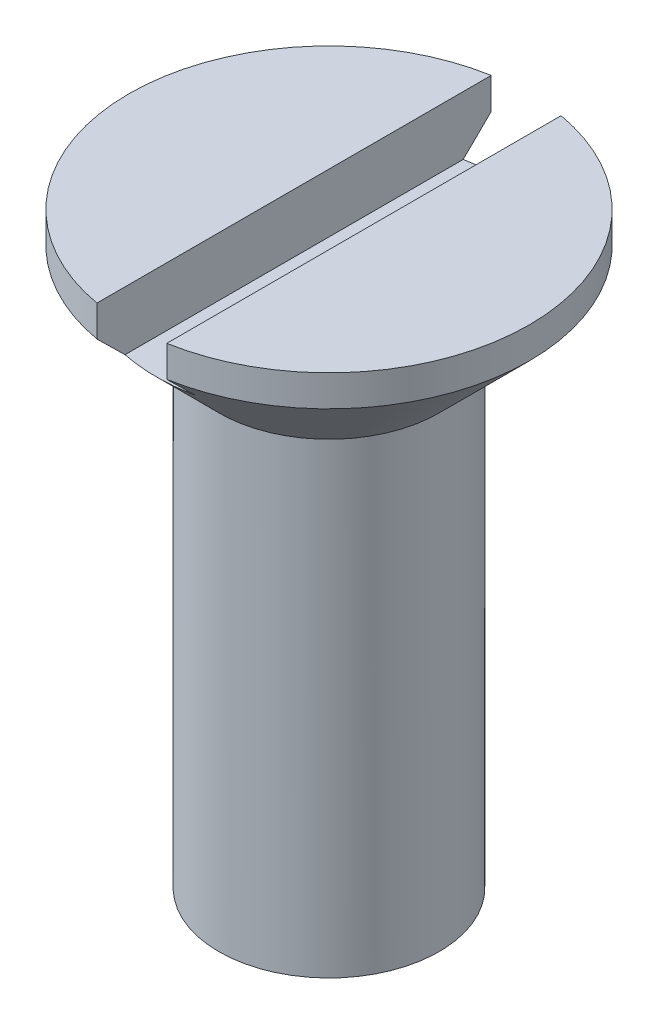
ISO-10303-21;
HEADER;
FILE_DESCRIPTION(('STEP AP214'),'2;1');
FILE_NAME('part.step','',(''),(''),'','','');
FILE_SCHEMA(('AUTOMOTIVE_DESIGN { 1 0 10303 214 1 1 1 1 }'));
ENDSEC;
DATA;
#1=APPLICATION_CONTEXT('core data for automotive mechanical design processes');
#2=APPLICATION_PROTOCOL_DEFINITION('international standard','automotive_design',2000,#1);
#3=PRODUCT_CONTEXT('',#1,'mechanical');
#4=PRODUCT('Part','Part','',(#3));
#5=PRODUCT_RELATED_PRODUCT_CATEGORY('part','',(#4));
#6=PRODUCT_DEFINITION_FORMATION('','',#4);
#7=PRODUCT_DEFINITION_CONTEXT('part definition',#1,'design');
#8=PRODUCT_DEFINITION('design','',#6,#7);
#9=PRODUCT_DEFINITION_SHAPE('','',#8);
#10=(LENGTH_UNIT() NAMED_UNIT(*) SI_UNIT(.MILLI.,.METRE.));
#11=(NAMED_UNIT(*) PLANE_ANGLE_UNIT() SI_UNIT($,.RADIAN.));
#12=(NAMED_UNIT(*) SI_UNIT($,.STERADIAN.) SOLID_ANGLE_UNIT());
#13=UNCERTAINTY_MEASURE_WITH_UNIT(LENGTH_MEASURE(1.E-05),#10,'distance_accuracy_value','');
#14=(GEOMETRIC_REPRESENTATION_CONTEXT(3) GLOBAL_UNCERTAINTY_ASSIGNED_CONTEXT((#13)) GLOBAL_UNIT_ASSIGNED_CONTEXT((#10,
#11,#12)) REPRESENTATION_CONTEXT('',''));
#15=CARTESIAN_POINT('',(0.,0.,0.));
#16=DIRECTION('',(0.,0.,1.));
#17=DIRECTION('',(1.,0.,0.));
#18=AXIS2_PLACEMENT_3D('',#15,#16,#17);
#19=CARTESIAN_POINT('',(0.,17.7320510346448,0.));
#20=DIRECTION('',(0.,1.,0.));
#21=DIRECTION('',(0.,0.,1.));
#22=AXIS2_PLACEMENT_3D('',#19,#20,#21);
#23=PLANE('',#22);
#24=DIRECTION('',(0.,0.,-1.));
#25=VECTOR('',#24,1.);
#26=CARTESIAN_POINT('',(0.9500000304,17.7320510346448,-5.45000017440001));
#27=LINE('',#26,#25);
#28=CARTESIAN_POINT('',(0.9500000304,17.7320510346448,5.36656331772951));
#29=VERTEX_POINT('',#28);
#30=CARTESIAN_POINT('',(0.9500000304,17.7320510346448,-5.36656331772953));
#31=VERTEX_POINT('',#30);
#32=EDGE_CURVE('E158',#29,#31,#27,.T.);
#33=ORIENTED_EDGE('',*,*,#32,.F.);
#34=CARTESIAN_POINT('',(0.,17.7320510346448,0.));
#35=DIRECTION('',(0.,-1.,0.));
#36=DIRECTION('',(0.,0.,-1.));
#37=AXIS2_PLACEMENT_3D('',#34,#35,#36);
#38=CIRCLE('',#37,5.4500001744);
#39=EDGE_CURVE('E106',#31,#29,#38,.T.);
#40=ORIENTED_EDGE('',*,*,#39,.F.);
#41=EDGE_LOOP('',(#33,#40));
#42=FACE_BOUND('',#41,.T.);
#43=ADVANCED_FACE('F39',(#42),#23,.T.);
#44=CARTESIAN_POINT('',(0.,-3.40349764957919E-07,0.));
#45=DIRECTION('',(0.,-1.,0.));
#46=DIRECTION('',(0.,0.,-1.));
#47=AXIS2_PLACEMENT_3D('',#44,#45,#46);
#48=CYLINDRICAL_SURFACE('',#47,5.4500001744);
#49=DIRECTION('',(0.,-1.,0.));
#50=VECTOR('',#49,1.);
#51=CARTESIAN_POINT('',(0.9500000304,-3.40349764957919E-07,5.36656331772951));
#52=LINE('',#51,#50);
#53=CARTESIAN_POINT('',(0.9500000304,16.8820510074448,5.36656331772951));
#54=VERTEX_POINT('',#53);
#55=EDGE_CURVE('E154',#54,#29,#52,.F.);
#56=ORIENTED_EDGE('',*,*,#55,.F.);
#57=CARTESIAN_POINT('',(0.,16.8820510074448,0.));
#58=DIRECTION('',(0.,-1.,0.));
#59=DIRECTION('',(0.,0.,-1.));
#60=AXIS2_PLACEMENT_3D('',#57,#58,#59);
#61=CIRCLE('',#60,5.4500001744);
#62=CARTESIAN_POINT('',(0.9500000304,16.8820510074448,-5.36656331772953));
#63=VERTEX_POINT('',#62);
#64=EDGE_CURVE('E119',#63,#54,#61,.T.);
#65=ORIENTED_EDGE('',*,*,#64,.F.);
#66=DIRECTION('',(0.,-1.,0.));
#67=VECTOR('',#66,1.);
#68=CARTESIAN_POINT('',(0.9500000304,-3.40349764957919E-07,-5.36656331772953));
#69=LINE('',#68,#67);
#70=EDGE_CURVE('E155',#31,#63,#69,.T.);
#71=ORIENTED_EDGE('',*,*,#70,.F.);
#72=ORIENTED_EDGE('',*,*,#39,.T.);
#73=EDGE_LOOP('',(#56,#65,#71,#72));
#74=FACE_BOUND('',#73,.T.);
#75=ADVANCED_FACE('F153',(#74),#48,.T.);
#76=DIRECTION('',(0.,0.,1.));
#77=VECTOR('',#76,1.);
#78=CARTESIAN_POINT('',(-0.9500000304,17.7320510346448,-5.45000017440001));
#79=LINE('',#78,#77);
#80=CARTESIAN_POINT('',(-0.9500000304,17.7320510346448,-5.36656331772953));
#81=VERTEX_POINT('',#80);
#82=CARTESIAN_POINT('',(-0.9500000304,17.7320510346448,5.36656331772951));
#83=VERTEX_POINT('',#82);
#84=EDGE_CURVE('E113',#81,#83,#79,.T.);
#85=ORIENTED_EDGE('',*,*,#84,.F.);
#86=EDGE_CURVE('E139',#83,#81,#38,.T.);
#87=ORIENTED_EDGE('',*,*,#86,.F.);
#88=EDGE_LOOP('',(#85,#87));
#89=FACE_BOUND('',#88,.T.);
#90=ADVANCED_FACE('F41',(#89),#23,.T.);
#91=DIRECTION('',(0.,-1.,0.));
#92=VECTOR('',#91,1.);
#93=CARTESIAN_POINT('',(-0.9500000304,-3.40349764957919E-07,-5.36656331772953));
#94=LINE('',#93,#92);
#95=CARTESIAN_POINT('',(-0.9500000304,16.8820510074448,-5.36656331772953));
#96=VERTEX_POINT('',#95);
#97=EDGE_CURVE('E129',#96,#81,#94,.F.);
#98=ORIENTED_EDGE('',*,*,#97,.F.);
#99=CARTESIAN_POINT('',(-0.9500000304,16.8820510074448,5.36656331772951));
#100=VERTEX_POINT('',#99);
#101=EDGE_CURVE('E137',#100,#96,#61,.T.);
#102=ORIENTED_EDGE('',*,*,#101,.F.);
#103=DIRECTION('',(0.,-1.,0.));
#104=VECTOR('',#103,1.);
#105=CARTESIAN_POINT('',(-0.9500000304,-3.40349764957919E-07,5.36656331772951));
#106=LINE('',#105,#104);
#107=EDGE_CURVE('E140',#83,#100,#106,.T.);
#108=ORIENTED_EDGE('',*,*,#107,.F.);
#109=ORIENTED_EDGE('',*,*,#86,.T.);
#110=EDGE_LOOP('',(#98,#102,#108,#109));
#111=FACE_BOUND('',#110,.T.);
#112=ADVANCED_FACE('F135',(#111),#48,.T.);
#113=CARTESIAN_POINT('',(0.,14.4320509290448,0.));
#114=DIRECTION('',(0.,1.,0.));
#115=DIRECTION('',(0.,0.,1.));
#116=AXIS2_PLACEMENT_3D('',#113,#114,#115);
#117=CONICAL_SURFACE('',#116,3.000000096,0.785398163397443);
#118=CARTESIAN_POINT('',(0.9500000304,16.8827510074672,-5.36727419959969));
#119=CARTESIAN_POINT('',(0.9500000304,16.7386924674401,-5.22096959393796));
#120=CARTESIAN_POINT('',(0.9500000304,16.5947180073482,-5.07458206767703));
#121=CARTESIAN_POINT('',(0.9500000304,16.3068610950055,-4.78142894707962));
#122=CARTESIAN_POINT('',(0.9500000304,16.1629788787331,-4.63466312106346));
#123=CARTESIAN_POINT('',(0.9500000304,15.8729593844081,-4.33821750612074));
#124=CARTESIAN_POINT('',(0.9500000304,15.7268275720015,-4.18853236453173));
#125=CARTESIAN_POINT('',(0.9500000304,15.4351469328919,-3.8888863725397));
#126=CARTESIAN_POINT('',(0.9500000304,15.2895976698632,-3.73892594648746));
#127=CARTESIAN_POINT('',(0.9500000304,14.9161940999164,-3.35268742755162));
#128=CARTESIAN_POINT('',(0.9500000304,14.6887726159211,-3.11598885228054));
#129=CARTESIAN_POINT('',(0.9500000304,14.3493162824682,-2.75849645227604));
#130=CARTESIAN_POINT('',(0.9500000304,14.2362338632747,-2.63869885409774));
#131=CARTESIAN_POINT('',(0.9500000304,14.0111738661827,-2.39816365495597));
#132=CARTESIAN_POINT('',(0.9500000304,13.8991958430073,-2.27742647115378));
#133=CARTESIAN_POINT('',(0.9500000304,13.6785322820133,-2.03630437028581));
#134=CARTESIAN_POINT('',(0.9500000304,13.5698225615911,-1.91594172872546));
#135=CARTESIAN_POINT('',(0.9500000304,13.4086408679578,-1.73355254953826));
#136=CARTESIAN_POINT('',(0.9500000304,13.3551841865324,-1.6723974720414));
#137=CARTESIAN_POINT('',(0.9500000304,13.2491651392265,-1.54931827031532));
#138=CARTESIAN_POINT('',(0.9500000304,13.1966027415451,-1.48739417356874));
#139=CARTESIAN_POINT('',(0.9500000304,13.0930615618723,-1.36295303138163));
#140=CARTESIAN_POINT('',(0.9500000304,13.0420743634795,-1.30044301192786));
#141=CARTESIAN_POINT('',(0.9500000304,12.9418277371085,-1.17405785121895));
#142=CARTESIAN_POINT('',(0.9500000304,12.8925680223448,-1.11018293941513));
#143=CARTESIAN_POINT('',(0.9500000304,12.7967351000262,-0.980693198526617));
#144=CARTESIAN_POINT('',(0.9500000304,12.7501553162811,-0.915083260555827));
#145=CARTESIAN_POINT('',(0.9500000304,12.6609914990495,-0.781218224398256));
#146=CARTESIAN_POINT('',(0.9500000304,12.6184032802871,-0.712966005313571));
#147=CARTESIAN_POINT('',(0.9500000304,12.5703966914203,-0.627290850299751));
#148=CARTESIAN_POINT('',(0.9500000304,12.5618340898567,-0.611626988447319));
#149=CARTESIAN_POINT('',(0.9500000304,12.5450800997927,-0.580097723188511));
#150=CARTESIAN_POINT('',(0.9500000304,12.5368887943255,-0.564232275707041));
#151=CARTESIAN_POINT('',(0.9500000304,12.5129403971186,-0.51632136229169));
#152=CARTESIAN_POINT('',(0.9500000304,12.4978073109211,-0.483958655690074));
#153=CARTESIAN_POINT('',(0.9500000304,12.4697969846611,-0.418661520161684));
#154=CARTESIAN_POINT('',(0.9500000304,12.4568979230908,-0.385736535895747));
#155=CARTESIAN_POINT('',(0.9500000304,12.4336823767042,-0.318972927188325));
#156=CARTESIAN_POINT('',(0.9500000304,12.423365760903,-0.285134349181913));
#157=CARTESIAN_POINT('',(0.9500000304,12.4076507179572,-0.223588333821897));
#158=CARTESIAN_POINT('',(0.9500000304,12.4016793032882,-0.196027960227424));
#159=CARTESIAN_POINT('',(0.9500000304,12.3919978331206,-0.140515150040987));
#160=CARTESIAN_POINT('',(0.9500000304,12.3882871021866,-0.112562833107725));
#161=CARTESIAN_POINT('',(0.9500000304,12.3833198519807,-0.0564821291073153));
#162=CARTESIAN_POINT('',(0.9500000304,12.382059347507,-0.0283541027207781));
#163=CARTESIAN_POINT('',(0.9500000304,12.3820424317756,0.0279054659386191));
#164=CARTESIAN_POINT('',(0.9500000304,12.3832868433798,0.0560370063303039));
#165=CARTESIAN_POINT('',(0.9500000304,12.3906964030186,0.139905479332309));
#166=CARTESIAN_POINT('',(0.9500000304,12.4005174856382,0.195353559613067));
#167=CARTESIAN_POINT('',(0.9500000304,12.4212392635837,0.276951867833311));
#168=CARTESIAN_POINT('',(0.9500000304,12.4291644662637,0.303935880524479));
#169=CARTESIAN_POINT('',(0.9500000304,12.4467257267006,0.357345335380134));
#170=CARTESIAN_POINT('',(0.9500000304,12.4563617242808,0.383770797154938));
#171=CARTESIAN_POINT('',(0.9500000304,12.4957012223133,0.483109347230748));
#172=CARTESIAN_POINT('',(0.9500000304,12.5303029483464,0.554072859978972));
#173=CARTESIAN_POINT('',(0.9500000304,12.6061626361591,0.692377117449927));
#174=CARTESIAN_POINT('',(0.9500000304,12.6474376925625,0.759707949504859));
#175=CARTESIAN_POINT('',(0.9500000304,12.7343854850621,0.89223677538721));
#176=CARTESIAN_POINT('',(0.9500000304,12.7800916453818,0.957412631904013));
#177=CARTESIAN_POINT('',(0.9500000304,12.8505883184324,1.05366877301934));
#178=CARTESIAN_POINT('',(0.9500000304,12.8743950592043,1.08548400099832));
#179=CARTESIAN_POINT('',(0.9500000304,12.9225515615799,1.14870025677815));
#180=CARTESIAN_POINT('',(0.9500000304,12.9469013045996,1.18010129869585));
#181=CARTESIAN_POINT('',(0.9500000304,13.0273739041995,1.28237591872893));
#182=CARTESIAN_POINT('',(0.9500000304,13.084418445076,1.35252331742302));
#183=CARTESIAN_POINT('',(0.9500000304,13.2000310090539,1.4915545225989));
#184=CARTESIAN_POINT('',(0.9500000304,13.2585992077668,1.56043818185235));
#185=CARTESIAN_POINT('',(0.9500000304,13.3768252266284,1.69730262915564));
#186=CARTESIAN_POINT('',(0.9500000304,13.4364834083381,1.76528310420166));
#187=CARTESIAN_POINT('',(0.9500000304,13.5565816269832,1.90055080820599));
#188=CARTESIAN_POINT('',(0.9500000304,13.617021682227,1.96783802086446));
#189=CARTESIAN_POINT('',(0.9500000304,13.7993749105463,2.1690966606266));
#190=CARTESIAN_POINT('',(0.9500000304,13.922158184723,2.30227887075167));
#191=CARTESIAN_POINT('',(0.9500000304,14.1690835403073,2.56731998157662));
#192=CARTESIAN_POINT('',(0.9500000304,14.2932253391472,2.69917914692435));
#193=CARTESIAN_POINT('',(0.9500000304,14.5418319603407,2.96141366505435));
#194=CARTESIAN_POINT('',(0.9500000304,14.6662924983618,3.09179308285569));
#195=CARTESIAN_POINT('',(0.9500000304,14.9158421696275,3.35196103898434));
#196=CARTESIAN_POINT('',(0.9500000304,15.0409313351696,3.48174954628529));
#197=CARTESIAN_POINT('',(0.9500000304,15.4167070471661,3.87032068264101));
#198=CARTESIAN_POINT('',(0.9500000304,15.668052021466,4.12846637735178));
#199=CARTESIAN_POINT('',(0.9500000304,15.9998954589287,4.46799579224712));
#200=CARTESIAN_POINT('',(0.9500000304,16.0799546261881,4.54981040638159));
#201=CARTESIAN_POINT('',(0.9500000304,16.2401700816485,4.7133624591396));
#202=CARTESIAN_POINT('',(0.9500000304,16.3203263796908,4.79509988813187));
#203=CARTESIAN_POINT('',(0.9500000304,16.4808279289504,4.95861812024817));
#204=CARTESIAN_POINT('',(0.9500000304,16.5611732865891,5.04039881886906));
#205=CARTESIAN_POINT('',(0.9500000304,16.7219201578178,5.20388687834712));
#206=CARTESIAN_POINT('',(0.9500000304,16.8023216640559,5.28559424643282));
#207=CARTESIAN_POINT('',(0.9500000304,16.8827510074672,5.36727419959967));
#208=B_SPLINE_CURVE_WITH_KNOTS('',3,(#118,#119,#120,#121,#122,#123,#124,#125,#126,#127,#128,
#129,#130,#131,#132,#133,#134,#135,#136,#137,#138,#139,#140,#141,#142,#143,#144,#145,#146,#147,
#148,#149,#150,#151,#152,#153,#154,#155,#156,#157,#158,#159,#160,#161,#162,#163,#164,#165,#166,
#167,#168,#169,#170,#171,#172,#173,#174,#175,#176,#177,#178,#179,#180,#181,#182,#183,#184,#185,
#186,#187,#188,#189,#190,#191,#192,#193,#194,#195,#196,#197,#198,#199,#200,#201,#202,#203,#204,
#205,#206,#207),.UNSPECIFIED.,.F.,.F.,(4,2,2,2,2,2,2,2,2,2,2,2,2,2,2,2,2,2,2,2,2,2,2,2,2,2,2,2,
2,2,2,2,2,2,2,2,2,2,2,2,2,2,2,2,4),(0.,0.615971753187665,1.23255947183599,1.86012634399137,
2.48706678820463,3.47179568391727,3.96600966616213,4.46001549550246,4.94655202863467,
5.19022214678605,5.43388358175057,5.67586603723658,5.91780812833059,6.15912870443953,
6.40019334960768,6.45374331565514,6.50730519865037,6.61441976779324,6.720420483239,
6.82641582110969,6.91093274455617,6.99542440407452,7.07977852570498,7.16416036208971,
7.33221954966706,7.41655157158534,7.50088062773281,7.73701725147457,7.97376864422853,
8.21247022016369,8.33167620281915,8.45087811198084,8.72208401518165,8.99332131633459,
9.2646502853567,9.53598561932056,10.0793985313587,10.6227004864284,11.1634402445434,
11.7042080746939,12.7850909172484,13.1284973323023,13.4719420697963,13.8158768192495,
14.1597727942722),.UNSPECIFIED.);
#209=CARTESIAN_POINT('',(0.9500000304,16.1320509834448,-4.60298830717611));
#210=VERTEX_POINT('',#209);
#211=EDGE_CURVE('E11',#63,#210,#208,.T.);
#212=ORIENTED_EDGE('',*,*,#211,.F.);
#213=ORIENTED_EDGE('',*,*,#64,.T.);
#214=CARTESIAN_POINT('',(0.9500000304,16.1320509834448,4.60298830717609));
#215=VERTEX_POINT('',#214);
#216=EDGE_CURVE('E43',#215,#54,#208,.T.);
#217=ORIENTED_EDGE('',*,*,#216,.F.);
#218=CARTESIAN_POINT('',(0.,16.1320509834448,0.));
#219=DIRECTION('',(0.,1.,0.));
#220=DIRECTION('',(0.,0.,1.));
#221=AXIS2_PLACEMENT_3D('',#218,#219,#220);
#222=CIRCLE('',#221,4.70000015039998);
#223=CARTESIAN_POINT('',(-0.9500000304,16.1320509834448,4.60298830717609));
#224=VERTEX_POINT('',#223);
#225=EDGE_CURVE('E97',#215,#224,#222,.F.);
#226=ORIENTED_EDGE('',*,*,#225,.T.);
#227=CARTESIAN_POINT('',(-0.9500000304,16.8827510074672,5.36727419959967));
#228=CARTESIAN_POINT('',(-0.9500000304,16.7386924674401,5.22096959393794));
#229=CARTESIAN_POINT('',(-0.9500000304,16.5947180073482,5.074582067677));
#230=CARTESIAN_POINT('',(-0.9500000304,16.3068610950055,4.7814289470796));
#231=CARTESIAN_POINT('',(-0.9500000304,16.1629788787331,4.63466312106344));
#232=CARTESIAN_POINT('',(-0.9500000304,15.8729593844081,4.33821750612071));
#233=CARTESIAN_POINT('',(-0.9500000304,15.7268275720015,4.18853236453171));
#234=CARTESIAN_POINT('',(-0.9500000304,15.4351469328919,3.88888637253968));
#235=CARTESIAN_POINT('',(-0.9500000304,15.2895976698632,3.73892594648743));
#236=CARTESIAN_POINT('',(-0.9500000304,14.9161940999164,3.35268742755159));
#237=CARTESIAN_POINT('',(-0.9500000304,14.6887726159211,3.11598885228052));
#238=CARTESIAN_POINT('',(-0.9500000304,14.3493162824682,2.75849645227601));
#239=CARTESIAN_POINT('',(-0.9500000304,14.2362338632747,2.63869885409771));
#240=CARTESIAN_POINT('',(-0.9500000304,14.0111738661827,2.39816365495594));
#241=CARTESIAN_POINT('',(-0.9500000304,13.8991958430073,2.27742647115376));
#242=CARTESIAN_POINT('',(-0.9500000304,13.6785322820133,2.03630437028579));
#243=CARTESIAN_POINT('',(-0.9500000304,13.5698225615911,1.91594172872544));
#244=CARTESIAN_POINT('',(-0.9500000304,13.4086408679578,1.73355254953823));
#245=CARTESIAN_POINT('',(-0.9500000304,13.3551841865324,1.67239747204138));
#246=CARTESIAN_POINT('',(-0.9500000304,13.2491651392265,1.5493182703153));
#247=CARTESIAN_POINT('',(-0.9500000304,13.1966027415451,1.48739417356872));
#248=CARTESIAN_POINT('',(-0.9500000304,13.0930615618723,1.3629530313816));
#249=CARTESIAN_POINT('',(-0.9500000304,13.0420743634795,1.30044301192784));
#250=CARTESIAN_POINT('',(-0.9500000304,12.9418277371085,1.17405785121893));
#251=CARTESIAN_POINT('',(-0.9500000304,12.8925680223448,1.11018293941511));
#252=CARTESIAN_POINT('',(-0.9500000304,12.7967351000262,0.980693198526595));
#253=CARTESIAN_POINT('',(-0.9500000304,12.7501553162811,0.915083260555806));
#254=CARTESIAN_POINT('',(-0.9500000304,12.6609914990495,0.781218224398235));
#255=CARTESIAN_POINT('',(-0.9500000304,12.6184032802871,0.71296600531355));
#256=CARTESIAN_POINT('',(-0.9500000304,12.5703966914203,0.62729085029973));
#257=CARTESIAN_POINT('',(-0.9500000304,12.5618340898567,0.611626988447298));
#258=CARTESIAN_POINT('',(-0.9500000304,12.5450800997927,0.58009772318849));
#259=CARTESIAN_POINT('',(-0.9500000304,12.5368887943255,0.56423227570702));
#260=CARTESIAN_POINT('',(-0.9500000304,12.5129403971186,0.516321362291669));
#261=CARTESIAN_POINT('',(-0.9500000304,12.4978073109211,0.483958655690054));
#262=CARTESIAN_POINT('',(-0.9500000304,12.4697969846611,0.418661520161663));
#263=CARTESIAN_POINT('',(-0.9500000304,12.4568979230908,0.385736535895727));
#264=CARTESIAN_POINT('',(-0.9500000304,12.4336823767042,0.318972927188305));
#265=CARTESIAN_POINT('',(-0.9500000304,12.423365760903,0.285134349181892));
#266=CARTESIAN_POINT('',(-0.9500000304,12.4076507179572,0.223588333821876));
#267=CARTESIAN_POINT('',(-0.9500000304,12.4016793032882,0.196027960227403));
#268=CARTESIAN_POINT('',(-0.9500000304,12.3919978331206,0.140515150040965));
#269=CARTESIAN_POINT('',(-0.9500000304,12.3882871021866,0.112562833107703));
#270=CARTESIAN_POINT('',(-0.9500000304,12.3833198519807,0.0564821291072936));
#271=CARTESIAN_POINT('',(-0.9500000304,12.382059347507,0.0283541027207564));
#272=CARTESIAN_POINT('',(-0.9500000304,12.3820424317756,-0.0279054659386404));
#273=CARTESIAN_POINT('',(-0.9500000304,12.3832868433798,-0.056037006330325));
#274=CARTESIAN_POINT('',(-0.9500000304,12.3906964030186,-0.13990547933233));
#275=CARTESIAN_POINT('',(-0.9500000304,12.4005174856382,-0.195353559613088));
#276=CARTESIAN_POINT('',(-0.9500000304,12.4212392635837,-0.276951867833332));
#277=CARTESIAN_POINT('',(-0.9500000304,12.4291644662637,-0.3039358805245));
#278=CARTESIAN_POINT('',(-0.9500000304,12.4467257267006,-0.357345335380155));
#279=CARTESIAN_POINT('',(-0.9500000304,12.4563617242808,-0.383770797154959));
#280=CARTESIAN_POINT('',(-0.9500000304,12.4957012223133,-0.483109347230769));
#281=CARTESIAN_POINT('',(-0.9500000304,12.5303029483464,-0.554072859978994));
#282=CARTESIAN_POINT('',(-0.9500000304,12.6061626361591,-0.692377117449949));
#283=CARTESIAN_POINT('',(-0.9500000304,12.6474376925625,-0.759707949504881));
#284=CARTESIAN_POINT('',(-0.9500000304,12.7343854850621,-0.892236775387232));
#285=CARTESIAN_POINT('',(-0.9500000304,12.7800916453818,-0.957412631904035));
#286=CARTESIAN_POINT('',(-0.9500000304,12.8505883184324,-1.05366877301936));
#287=CARTESIAN_POINT('',(-0.9500000304,12.8743950592043,-1.08548400099834));
#288=CARTESIAN_POINT('',(-0.9500000304,12.9225515615799,-1.14870025677817));
#289=CARTESIAN_POINT('',(-0.9500000304,12.9469013045996,-1.18010129869587));
#290=CARTESIAN_POINT('',(-0.9500000304,13.0273739041995,-1.28237591872895));
#291=CARTESIAN_POINT('',(-0.9500000304,13.084418445076,-1.35252331742305));
#292=CARTESIAN_POINT('',(-0.9500000304,13.2000310090539,-1.49155452259892));
#293=CARTESIAN_POINT('',(-0.9500000304,13.2585992077668,-1.56043818185237));
#294=CARTESIAN_POINT('',(-0.9500000304,13.3768252266284,-1.69730262915566));
#295=CARTESIAN_POINT('',(-0.9500000304,13.4364834083381,-1.76528310420168));
#296=CARTESIAN_POINT('',(-0.9500000304,13.5565816269832,-1.90055080820601));
#297=CARTESIAN_POINT('',(-0.9500000304,13.617021682227,-1.96783802086448));
#298=CARTESIAN_POINT('',(-0.9500000304,13.7993749105463,-2.16909666062662));
#299=CARTESIAN_POINT('',(-0.9500000304,13.922158184723,-2.30227887075169));
#300=CARTESIAN_POINT('',(-0.9500000304,14.1690835403073,-2.56731998157664));
#301=CARTESIAN_POINT('',(-0.9500000304,14.2932253391472,-2.69917914692437));
#302=CARTESIAN_POINT('',(-0.9500000304,14.5418319603407,-2.96141366505437));
#303=CARTESIAN_POINT('',(-0.9500000304,14.6662924983618,-3.09179308285571));
#304=CARTESIAN_POINT('',(-0.9500000304,14.9158421696275,-3.35196103898436));
#305=CARTESIAN_POINT('',(-0.9500000304,15.0409313351696,-3.48174954628531));
#306=CARTESIAN_POINT('',(-0.9500000304,15.4167070471661,-3.87032068264103));
#307=CARTESIAN_POINT('',(-0.9500000304,15.668052021466,-4.1284663773518));
#308=CARTESIAN_POINT('',(-0.9500000304,15.9998954589287,-4.46799579224714));
#309=CARTESIAN_POINT('',(-0.9500000304,16.0799546261881,-4.54981040638161));
#310=CARTESIAN_POINT('',(-0.9500000304,16.2401700816485,-4.71336245913962));
#311=CARTESIAN_POINT('',(-0.9500000304,16.3203263796908,-4.79509988813189));
#312=CARTESIAN_POINT('',(-0.9500000304,16.4808279289504,-4.95861812024819));
#313=CARTESIAN_POINT('',(-0.9500000304,16.5611732865891,-5.04039881886908));
#314=CARTESIAN_POINT('',(-0.9500000304,16.7219201578178,-5.20388687834714));
#315=CARTESIAN_POINT('',(-0.9500000304,16.8023216640559,-5.28559424643284));
#316=CARTESIAN_POINT('',(-0.9500000304,16.8827510074672,-5.36727419959969));
#317=B_SPLINE_CURVE_WITH_KNOTS('',3,(#227,#228,#229,#230,#231,#232,#233,#234,#235,#236,#237,
#238,#239,#240,#241,#242,#243,#244,#245,#246,#247,#248,#249,#250,#251,#252,#253,#254,#255,#256,
#257,#258,#259,#260,#261,#262,#263,#264,#265,#266,#267,#268,#269,#270,#271,#272,#273,#274,#275,
#276,#277,#278,#279,#280,#281,#282,#283,#284,#285,#286,#287,#288,#289,#290,#291,#292,#293,#294,
#295,#296,#297,#298,#299,#300,#301,#302,#303,#304,#305,#306,#307,#308,#309,#310,#311,#312,#313,
#314,#315,#316),.UNSPECIFIED.,.F.,.F.,(4,2,2,2,2,2,2,2,2,2,2,2,2,2,2,2,2,2,2,2,2,2,2,2,2,2,2,2,
2,2,2,2,2,2,2,2,2,2,2,2,2,2,2,2,4),(0.,0.615971753187669,1.232559471836,1.86012634399137,
2.48706678820464,3.47179568391727,3.96600966616214,4.46001549550247,4.94655202863468,
5.19022214678606,5.43388358175057,5.67586603723658,5.9178081283306,6.15912870443953,
6.40019334960768,6.45374331565514,6.50730519865037,6.61441976779323,6.720420483239,
6.82641582110969,6.91093274455617,6.99542440407452,7.07977852570498,7.1641603620897,
7.33221954966706,7.41655157158534,7.50088062773281,7.73701725147457,7.97376864422854,
8.21247022016369,8.33167620281915,8.45087811198084,8.72208401518165,8.9933213163346,
9.26465028535671,9.53598561932056,10.0793985313587,10.6227004864284,11.1634402445434,
11.7042080746939,12.7850909172484,13.1284973323023,13.4719420697963,13.8158768192495,
14.1597727942722),.UNSPECIFIED.);
#318=EDGE_CURVE('E105',#100,#224,#317,.T.);
#319=ORIENTED_EDGE('',*,*,#318,.F.);
#320=ORIENTED_EDGE('',*,*,#101,.T.);
#321=CARTESIAN_POINT('',(-0.9500000304,16.1320509834448,-4.60298830717611));
#322=VERTEX_POINT('',#321);
#323=EDGE_CURVE('E54',#322,#96,#317,.T.);
#324=ORIENTED_EDGE('',*,*,#323,.F.);
#325=EDGE_CURVE('E108',#322,#210,#222,.F.);
#326=ORIENTED_EDGE('',*,*,#325,.T.);
#327=EDGE_LOOP('',(#212,#213,#217,#226,#319,#320,#324,#326));
#328=FACE_BOUND('',#327,.T.);
#329=CARTESIAN_POINT('',(0.,14.4320509290448,0.));
#330=DIRECTION('',(0.,-1.,0.));
#331=DIRECTION('',(0.,0.,-1.));
#332=AXIS2_PLACEMENT_3D('',#329,#330,#331);
#333=CIRCLE('',#332,3.000000096);
#334=CARTESIAN_POINT('',(0.,14.4320509290448,-3.00000009600001));
#335=VERTEX_POINT('',#334);
#336=EDGE_CURVE('E142',#335,#335,#333,.T.);
#337=ORIENTED_EDGE('',*,*,#336,.F.);
#338=EDGE_LOOP('',(#337));
#339=FACE_BOUND('',#338,.T.);
#340=ADVANCED_FACE('F116',(#328,#339),#117,.T.);
#341=CARTESIAN_POINT('',(0.,-3.40349764957919E-07,0.));
#342=DIRECTION('',(0.,-1.,0.));
#343=DIRECTION('',(0.,0.,-1.));
#344=AXIS2_PLACEMENT_3D('',#341,#342,#343);
#345=CYLINDRICAL_SURFACE('',#344,3.000000096);
#346=ORIENTED_EDGE('',*,*,#336,.T.);
#347=EDGE_LOOP('',(#346));
#348=FACE_BOUND('',#347,.T.);
#349=CARTESIAN_POINT('',(0.,1.73205052264476,0.));
#350=DIRECTION('',(0.,-1.,0.));
#351=DIRECTION('',(0.,0.,-1.));
#352=AXIS2_PLACEMENT_3D('',#349,#350,#351);
#353=CIRCLE('',#352,3.000000096);
#354=CARTESIAN_POINT('',(0.,1.73205052264476,-3.00000009600001));
#355=VERTEX_POINT('',#354);
#356=EDGE_CURVE('E145',#355,#355,#353,.T.);
#357=ORIENTED_EDGE('',*,*,#356,.F.);
#358=EDGE_LOOP('',(#357));
#359=FACE_BOUND('',#358,.T.);
#360=ADVANCED_FACE('F170',(#348,#359),#345,.T.);
#361=CARTESIAN_POINT('',(0.,-3.40349764957919E-07,0.));
#362=DIRECTION('',(0.,1.,0.));
#363=DIRECTION('',(0.,0.,1.));
#364=AXIS2_PLACEMENT_3D('',#361,#362,#363);
#365=CONICAL_SURFACE('',#364,0.,1.04719755119659);
#366=ORIENTED_EDGE('',*,*,#356,.T.);
#367=EDGE_LOOP('',(#366));
#368=FACE_BOUND('',#367,.T.);
#369=CARTESIAN_POINT('',(0.,-3.40349764957919E-07,0.));
#370=VERTEX_POINT('',#369);
#371=VERTEX_LOOP('',#370);
#372=FACE_BOUND('',#371,.T.);
#373=ADVANCED_FACE('F168',(#368,#372),#365,.T.);
#374=CARTESIAN_POINT('',(0.9500000304,16.1320509834448,-5.45000017440001));
#375=DIRECTION('',(1.,0.,0.));
#376=DIRECTION('',(0.,0.,-1.));
#377=AXIS2_PLACEMENT_3D('',#374,#375,#376);
#378=PLANE('',#377);
#379=ORIENTED_EDGE('',*,*,#70,.T.);
#380=ORIENTED_EDGE('',*,*,#211,.T.);
#381=DIRECTION('',(0.,0.,-1.));
#382=VECTOR('',#381,1.);
#383=CARTESIAN_POINT('',(0.9500000304,16.1320509834448,-5.45000017440001));
#384=LINE('',#383,#382);
#385=EDGE_CURVE('E100',#215,#210,#384,.T.);
#386=ORIENTED_EDGE('',*,*,#385,.F.);
#387=ORIENTED_EDGE('',*,*,#216,.T.);
#388=ORIENTED_EDGE('',*,*,#55,.T.);
#389=ORIENTED_EDGE('',*,*,#32,.T.);
#390=EDGE_LOOP('',(#379,#380,#386,#387,#388,#389));
#391=FACE_BOUND('',#390,.T.);
#392=ADVANCED_FACE('F110',(#391),#378,.F.);
#393=CARTESIAN_POINT('',(-0.9500000304,16.1320509834448,-5.45000017440001));
#394=DIRECTION('',(-1.,0.,0.));
#395=DIRECTION('',(0.,0.,1.));
#396=AXIS2_PLACEMENT_3D('',#393,#394,#395);
#397=PLANE('',#396);
#398=ORIENTED_EDGE('',*,*,#107,.T.);
#399=ORIENTED_EDGE('',*,*,#318,.T.);
#400=DIRECTION('',(0.,0.,1.));
#401=VECTOR('',#400,1.);
#402=CARTESIAN_POINT('',(-0.9500000304,16.1320509834448,-5.45000017440001));
#403=LINE('',#402,#401);
#404=EDGE_CURVE('E61',#322,#224,#403,.T.);
#405=ORIENTED_EDGE('',*,*,#404,.F.);
#406=ORIENTED_EDGE('',*,*,#323,.T.);
#407=ORIENTED_EDGE('',*,*,#97,.T.);
#408=ORIENTED_EDGE('',*,*,#84,.T.);
#409=EDGE_LOOP('',(#398,#399,#405,#406,#407,#408));
#410=FACE_BOUND('',#409,.T.);
#411=ADVANCED_FACE('F128',(#410),#397,.F.);
#412=CARTESIAN_POINT('',(0.,16.1320509834448,0.));
#413=DIRECTION('',(0.,1.,0.));
#414=DIRECTION('',(0.,0.,1.));
#415=AXIS2_PLACEMENT_3D('',#412,#413,#414);
#416=PLANE('',#415);
#417=ORIENTED_EDGE('',*,*,#404,.T.);
#418=ORIENTED_EDGE('',*,*,#225,.F.);
#419=ORIENTED_EDGE('',*,*,#385,.T.);
#420=ORIENTED_EDGE('',*,*,#325,.F.);
#421=EDGE_LOOP('',(#417,#418,#419,#420));
#422=FACE_BOUND('',#421,.T.);
#423=ADVANCED_FACE('F99',(#422),#416,.T.);
#424=CLOSED_SHELL('',(#43,#75,#90,#112,#340,#360,#373,#392,#411,#423));
#425=MANIFOLD_SOLID_BREP('B2',#424);
#426=ADVANCED_BREP_SHAPE_REPRESENTATION('',(#18,#425),#14);
#427=SHAPE_DEFINITION_REPRESENTATION(#9,#426);
ENDSEC;
END-ISO-10303-21;
